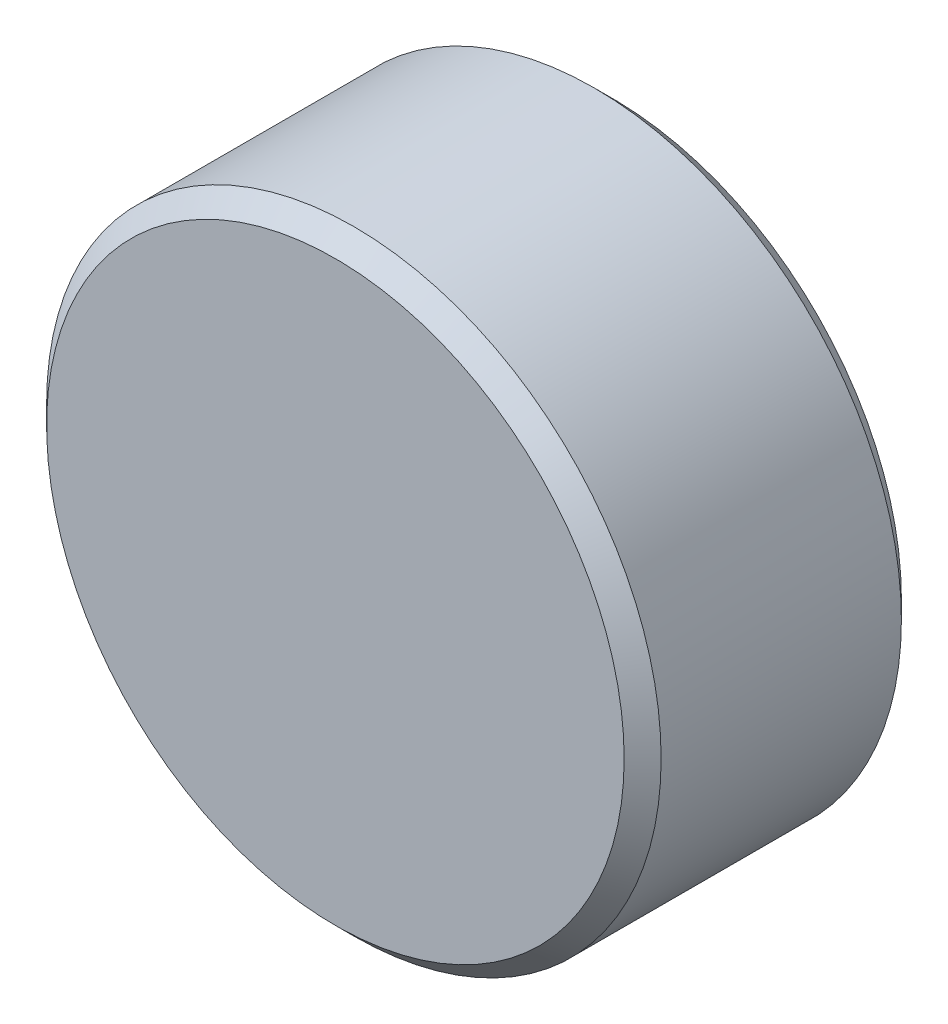
ISO-10303-21;
HEADER;
FILE_DESCRIPTION(('STEP AP214'),'2;1');
FILE_NAME('part.step','',(''),(''),'','','');
FILE_SCHEMA(('AUTOMOTIVE_DESIGN { 1 0 10303 214 1 1 1 1 }'));
ENDSEC;
DATA;
#1=APPLICATION_CONTEXT('core data for automotive mechanical design processes');
#2=APPLICATION_PROTOCOL_DEFINITION('international standard','automotive_design',2000,#1);
#3=PRODUCT_CONTEXT('',#1,'mechanical');
#4=PRODUCT('Part','Part','',(#3));
#5=PRODUCT_RELATED_PRODUCT_CATEGORY('part','',(#4));
#6=PRODUCT_DEFINITION_FORMATION('','',#4);
#7=PRODUCT_DEFINITION_CONTEXT('part definition',#1,'design');
#8=PRODUCT_DEFINITION('design','',#6,#7);
#9=PRODUCT_DEFINITION_SHAPE('','',#8);
#10=(LENGTH_UNIT() NAMED_UNIT(*) SI_UNIT(.MILLI.,.METRE.));
#11=(NAMED_UNIT(*) PLANE_ANGLE_UNIT() SI_UNIT($,.RADIAN.));
#12=(NAMED_UNIT(*) SI_UNIT($,.STERADIAN.) SOLID_ANGLE_UNIT());
#13=UNCERTAINTY_MEASURE_WITH_UNIT(LENGTH_MEASURE(1.E-05),#10,'distance_accuracy_value','');
#14=(GEOMETRIC_REPRESENTATION_CONTEXT(3) GLOBAL_UNCERTAINTY_ASSIGNED_CONTEXT((#13)) GLOBAL_UNIT_ASSIGNED_CONTEXT((#10,
#11,#12)) REPRESENTATION_CONTEXT('',''));
#15=CARTESIAN_POINT('',(0.,0.,0.));
#16=DIRECTION('',(0.,0.,1.));
#17=DIRECTION('',(1.,0.,0.));
#18=AXIS2_PLACEMENT_3D('',#15,#16,#17);
#19=CARTESIAN_POINT('',(0.,0.,30.));
#20=DIRECTION('',(0.,0.,-1.));
#21=DIRECTION('',(-1.,0.,0.));
#22=AXIS2_PLACEMENT_3D('',#19,#20,#21);
#23=CYLINDRICAL_SURFACE('',#22,33.25);
#24=CARTESIAN_POINT('',(0.,0.,2.00000000000001));
#25=DIRECTION('',(0.,0.,1.));
#26=DIRECTION('',(1.,0.,0.));
#27=AXIS2_PLACEMENT_3D('',#24,#25,#26);
#28=CIRCLE('',#27,33.25);
#29=CARTESIAN_POINT('',(33.25,0.,2.00000000000001));
#30=VERTEX_POINT('',#29);
#31=EDGE_CURVE('E36',#30,#30,#28,.T.);
#32=ORIENTED_EDGE('',*,*,#31,.T.);
#33=EDGE_LOOP('',(#32));
#34=FACE_BOUND('',#33,.T.);
#35=CARTESIAN_POINT('',(0.,0.,28.));
#36=DIRECTION('',(0.,0.,1.));
#37=DIRECTION('',(1.,0.,0.));
#38=AXIS2_PLACEMENT_3D('',#35,#36,#37);
#39=CIRCLE('',#38,33.25);
#40=CARTESIAN_POINT('',(33.25,0.,28.));
#41=VERTEX_POINT('',#40);
#42=EDGE_CURVE('E40',#41,#41,#39,.F.);
#43=ORIENTED_EDGE('',*,*,#42,.T.);
#44=EDGE_LOOP('',(#43));
#45=FACE_BOUND('',#44,.T.);
#46=ADVANCED_FACE('F29',(#34,#45),#23,.T.);
#47=CARTESIAN_POINT('',(0.,0.,30.));
#48=DIRECTION('',(0.,0.,1.));
#49=DIRECTION('',(1.,0.,0.));
#50=AXIS2_PLACEMENT_3D('',#47,#48,#49);
#51=PLANE('',#50);
#52=CARTESIAN_POINT('',(0.,0.,30.));
#53=DIRECTION('',(0.,0.,1.));
#54=DIRECTION('',(1.,0.,0.));
#55=AXIS2_PLACEMENT_3D('',#52,#53,#54);
#56=CIRCLE('',#55,31.25);
#57=CARTESIAN_POINT('',(31.25,0.,30.));
#58=VERTEX_POINT('',#57);
#59=EDGE_CURVE('E44',#58,#58,#56,.T.);
#60=ORIENTED_EDGE('',*,*,#59,.T.);
#61=EDGE_LOOP('',(#60));
#62=FACE_BOUND('',#61,.T.);
#63=ADVANCED_FACE('F50',(#62),#51,.T.);
#64=CARTESIAN_POINT('',(0.,0.,0.));
#65=DIRECTION('',(0.,0.,1.));
#66=DIRECTION('',(1.,0.,0.));
#67=AXIS2_PLACEMENT_3D('',#64,#65,#66);
#68=PLANE('',#67);
#69=CARTESIAN_POINT('',(0.,0.,0.));
#70=DIRECTION('',(0.,0.,1.));
#71=DIRECTION('',(1.,0.,0.));
#72=AXIS2_PLACEMENT_3D('',#69,#70,#71);
#73=CIRCLE('',#72,31.25);
#74=CARTESIAN_POINT('',(31.25,0.,0.));
#75=VERTEX_POINT('',#74);
#76=EDGE_CURVE('E10',#75,#75,#73,.F.);
#77=ORIENTED_EDGE('',*,*,#76,.T.);
#78=EDGE_LOOP('',(#77));
#79=FACE_BOUND('',#78,.T.);
#80=ADVANCED_FACE('F54',(#79),#68,.F.);
#81=CARTESIAN_POINT('',(0.,0.,30.));
#82=DIRECTION('',(0.,0.,-1.));
#83=DIRECTION('',(-1.,0.,0.));
#84=AXIS2_PLACEMENT_3D('',#81,#82,#83);
#85=CONICAL_SURFACE('',#84,31.25,0.785398163397445);
#86=ORIENTED_EDGE('',*,*,#42,.F.);
#87=EDGE_LOOP('',(#86));
#88=FACE_BOUND('',#87,.T.);
#89=ORIENTED_EDGE('',*,*,#59,.F.);
#90=EDGE_LOOP('',(#89));
#91=FACE_BOUND('',#90,.T.);
#92=ADVANCED_FACE('F52',(#88,#91),#85,.T.);
#93=CARTESIAN_POINT('',(0.,0.,2.00000000000001));
#94=DIRECTION('',(0.,0.,1.));
#95=DIRECTION('',(1.,0.,0.));
#96=AXIS2_PLACEMENT_3D('',#93,#94,#95);
#97=CONICAL_SURFACE('',#96,33.25,0.785398163397453);
#98=ORIENTED_EDGE('',*,*,#76,.F.);
#99=EDGE_LOOP('',(#98));
#100=FACE_BOUND('',#99,.T.);
#101=ORIENTED_EDGE('',*,*,#31,.F.);
#102=EDGE_LOOP('',(#101));
#103=FACE_BOUND('',#102,.T.);
#104=ADVANCED_FACE('F31',(#100,#103),#97,.T.);
#105=CLOSED_SHELL('',(#46,#63,#80,#92,#104));
#106=MANIFOLD_SOLID_BREP('B2',#105);
#107=ADVANCED_BREP_SHAPE_REPRESENTATION('',(#18,#106),#14);
#108=SHAPE_DEFINITION_REPRESENTATION(#9,#107);
ENDSEC;
END-ISO-10303-21;
